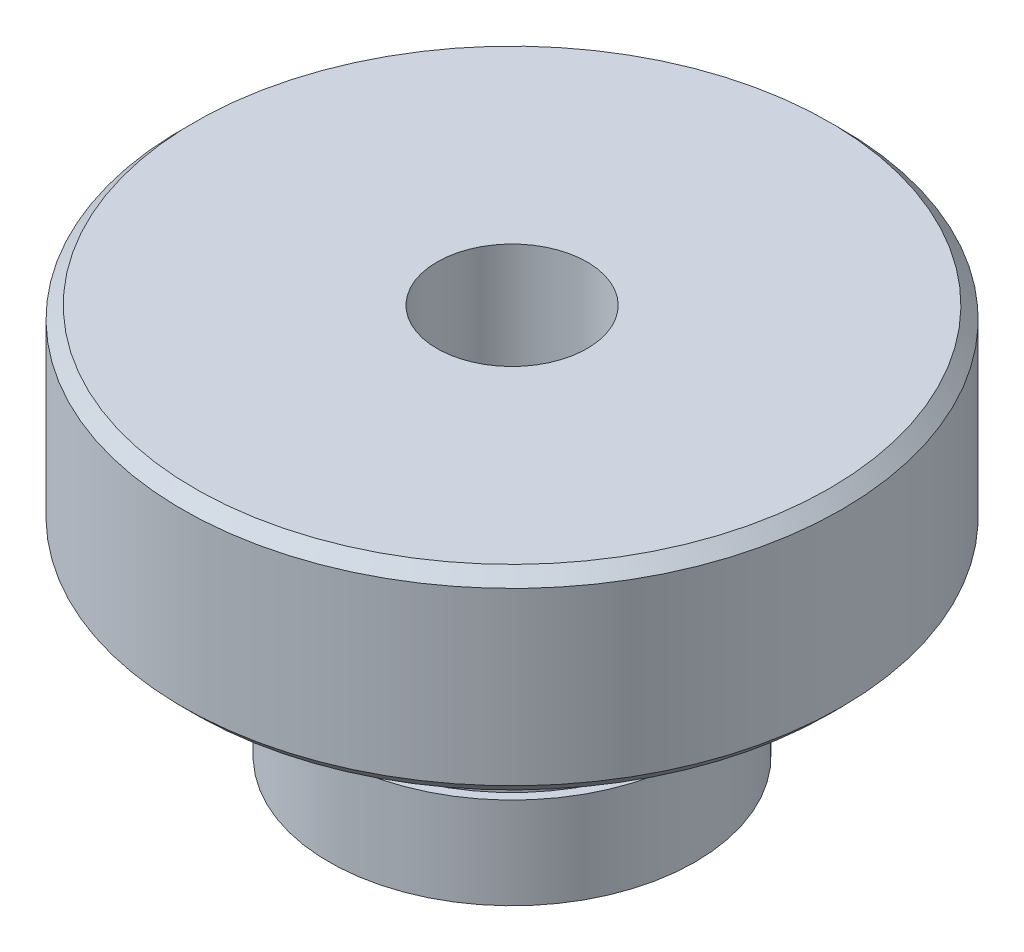
ISO-10303-21;
HEADER;
FILE_DESCRIPTION(('STEP AP214'),'2;1');
FILE_NAME('part.step','',(''),(''),'','','');
FILE_SCHEMA(('AUTOMOTIVE_DESIGN { 1 0 10303 214 1 1 1 1 }'));
ENDSEC;
DATA;
#1=APPLICATION_CONTEXT('core data for automotive mechanical design processes');
#2=APPLICATION_PROTOCOL_DEFINITION('international standard','automotive_design',2000,#1);
#3=PRODUCT_CONTEXT('',#1,'mechanical');
#4=PRODUCT('Part','Part','',(#3));
#5=PRODUCT_RELATED_PRODUCT_CATEGORY('part','',(#4));
#6=PRODUCT_DEFINITION_FORMATION('','',#4);
#7=PRODUCT_DEFINITION_CONTEXT('part definition',#1,'design');
#8=PRODUCT_DEFINITION('design','',#6,#7);
#9=PRODUCT_DEFINITION_SHAPE('','',#8);
#10=(LENGTH_UNIT() NAMED_UNIT(*) SI_UNIT(.MILLI.,.METRE.));
#11=(NAMED_UNIT(*) PLANE_ANGLE_UNIT() SI_UNIT($,.RADIAN.));
#12=(NAMED_UNIT(*) SI_UNIT($,.STERADIAN.) SOLID_ANGLE_UNIT());
#13=UNCERTAINTY_MEASURE_WITH_UNIT(LENGTH_MEASURE(1.E-05),#10,'distance_accuracy_value','');
#14=(GEOMETRIC_REPRESENTATION_CONTEXT(3) GLOBAL_UNCERTAINTY_ASSIGNED_CONTEXT((#13)) GLOBAL_UNIT_ASSIGNED_CONTEXT((#10,
#11,#12)) REPRESENTATION_CONTEXT('',''));
#15=CARTESIAN_POINT('',(0.,0.,0.));
#16=DIRECTION('',(0.,0.,1.));
#17=DIRECTION('',(1.,0.,0.));
#18=AXIS2_PLACEMENT_3D('',#15,#16,#17);
#19=CARTESIAN_POINT('',(0.,-10.1601932355876,0.));
#20=DIRECTION('',(0.,1.,0.));
#21=DIRECTION('',(-1.,0.,0.));
#22=AXIS2_PLACEMENT_3D('',#19,#20,#21);
#23=CYLINDRICAL_SURFACE('',#22,1.2295);
#24=CARTESIAN_POINT('',(0.,0.,0.));
#25=DIRECTION('',(0.,1.,0.));
#26=DIRECTION('',(-1.,0.,0.));
#27=AXIS2_PLACEMENT_3D('',#24,#25,#26);
#28=CIRCLE('',#27,1.2295);
#29=CARTESIAN_POINT('',(1.2295,0.,0.));
#30=VERTEX_POINT('',#29);
#31=EDGE_CURVE('E34',#30,#30,#28,.T.);
#32=ORIENTED_EDGE('',*,*,#31,.F.);
#33=EDGE_LOOP('',(#32));
#34=FACE_BOUND('',#33,.T.);
#35=CARTESIAN_POINT('',(0.,6.4,0.));
#36=DIRECTION('',(0.,-1.,0.));
#37=DIRECTION('',(-1.,0.,0.));
#38=AXIS2_PLACEMENT_3D('',#35,#36,#37);
#39=CIRCLE('',#38,1.2295);
#40=CARTESIAN_POINT('',(-1.2295,6.4,0.));
#41=VERTEX_POINT('',#40);
#42=EDGE_CURVE('E72',#41,#41,#39,.T.);
#43=ORIENTED_EDGE('',*,*,#42,.F.);
#44=EDGE_LOOP('',(#43));
#45=FACE_BOUND('',#44,.T.);
#46=ADVANCED_FACE('F17',(#34,#45),#23,.F.);
#47=CARTESIAN_POINT('',(0.,3.3,0.));
#48=DIRECTION('',(0.,1.,0.));
#49=DIRECTION('',(-1.,0.,0.));
#50=AXIS2_PLACEMENT_3D('',#47,#48,#49);
#51=CONICAL_SURFACE('',#50,5.3,0.785398163397446);
#52=CARTESIAN_POINT('',(0.,3.4,0.));
#53=DIRECTION('',(0.,-1.,0.));
#54=DIRECTION('',(-1.,0.,0.));
#55=AXIS2_PLACEMENT_3D('',#52,#53,#54);
#56=CIRCLE('',#55,5.4);
#57=CARTESIAN_POINT('',(5.4,3.4,0.));
#58=VERTEX_POINT('',#57);
#59=EDGE_CURVE('E11',#58,#58,#56,.T.);
#60=ORIENTED_EDGE('',*,*,#59,.T.);
#61=EDGE_LOOP('',(#60));
#62=FACE_BOUND('',#61,.T.);
#63=CARTESIAN_POINT('',(0.,3.2,0.));
#64=DIRECTION('',(0.,1.,0.));
#65=DIRECTION('',(-1.,0.,0.));
#66=AXIS2_PLACEMENT_3D('',#63,#64,#65);
#67=CIRCLE('',#66,5.2);
#68=CARTESIAN_POINT('',(5.2,3.2,0.));
#69=VERTEX_POINT('',#68);
#70=EDGE_CURVE('E27',#69,#69,#67,.T.);
#71=ORIENTED_EDGE('',*,*,#70,.T.);
#72=EDGE_LOOP('',(#71));
#73=FACE_BOUND('',#72,.T.);
#74=ADVANCED_FACE('F111',(#62,#73),#51,.T.);
#75=CARTESIAN_POINT('',(0.,4.8,0.));
#76=DIRECTION('',(0.,-1.,0.));
#77=DIRECTION('',(1.,0.,0.));
#78=AXIS2_PLACEMENT_3D('',#75,#76,#77);
#79=CYLINDRICAL_SURFACE('',#78,5.4);
#80=CARTESIAN_POINT('',(0.,6.2,0.));
#81=DIRECTION('',(0.,1.,0.));
#82=DIRECTION('',(-1.,0.,0.));
#83=AXIS2_PLACEMENT_3D('',#80,#81,#82);
#84=CIRCLE('',#83,5.4);
#85=CARTESIAN_POINT('',(5.4,6.2,0.));
#86=VERTEX_POINT('',#85);
#87=EDGE_CURVE('E74',#86,#86,#84,.T.);
#88=ORIENTED_EDGE('',*,*,#87,.F.);
#89=EDGE_LOOP('',(#88));
#90=FACE_BOUND('',#89,.T.);
#91=ORIENTED_EDGE('',*,*,#59,.F.);
#92=EDGE_LOOP('',(#91));
#93=FACE_BOUND('',#92,.T.);
#94=ADVANCED_FACE('F116',(#90,#93),#79,.T.);
#95=CARTESIAN_POINT('',(2.85,3.2,0.));
#96=DIRECTION('',(0.,-1.,0.));
#97=DIRECTION('',(0.707106781186548,0.,0.707106781186548));
#98=AXIS2_PLACEMENT_3D('',#95,#96,#97);
#99=PLANE('',#98);
#100=CARTESIAN_POINT('',(0.,3.2,0.));
#101=DIRECTION('',(0.,-1.,0.));
#102=DIRECTION('',(-1.,0.,0.));
#103=AXIS2_PLACEMENT_3D('',#100,#101,#102);
#104=CIRCLE('',#103,4.45);
#105=CARTESIAN_POINT('',(4.45,3.2,0.));
#106=VERTEX_POINT('',#105);
#107=EDGE_CURVE('E75',#106,#106,#104,.T.);
#108=ORIENTED_EDGE('',*,*,#107,.F.);
#109=EDGE_LOOP('',(#108));
#110=FACE_BOUND('',#109,.T.);
#111=ORIENTED_EDGE('',*,*,#70,.F.);
#112=EDGE_LOOP('',(#111));
#113=FACE_BOUND('',#112,.T.);
#114=ADVANCED_FACE('F123',(#110,#113),#99,.T.);
#115=CARTESIAN_POINT('',(0.,6.3,0.));
#116=DIRECTION('',(0.,-1.,0.));
#117=DIRECTION('',(-1.,0.,0.));
#118=AXIS2_PLACEMENT_3D('',#115,#116,#117);
#119=CONICAL_SURFACE('',#118,5.3,0.785398163397448);
#120=CARTESIAN_POINT('',(0.,6.4,0.));
#121=DIRECTION('',(0.,-1.,0.));
#122=DIRECTION('',(-1.,0.,0.));
#123=AXIS2_PLACEMENT_3D('',#120,#121,#122);
#124=CIRCLE('',#123,5.2);
#125=CARTESIAN_POINT('',(5.2,6.4,0.));
#126=VERTEX_POINT('',#125);
#127=EDGE_CURVE('E79',#126,#126,#124,.T.);
#128=ORIENTED_EDGE('',*,*,#127,.T.);
#129=EDGE_LOOP('',(#128));
#130=FACE_BOUND('',#129,.T.);
#131=ORIENTED_EDGE('',*,*,#87,.T.);
#132=EDGE_LOOP('',(#131));
#133=FACE_BOUND('',#132,.T.);
#134=ADVANCED_FACE('F107',(#130,#133),#119,.T.);
#135=CARTESIAN_POINT('',(5.4,6.4,0.));
#136=DIRECTION('',(0.,1.,0.));
#137=DIRECTION('',(0.707106781186548,0.,0.707106781186548));
#138=AXIS2_PLACEMENT_3D('',#135,#136,#137);
#139=PLANE('',#138);
#140=ORIENTED_EDGE('',*,*,#42,.T.);
#141=EDGE_LOOP('',(#140));
#142=FACE_BOUND('',#141,.T.);
#143=ORIENTED_EDGE('',*,*,#127,.F.);
#144=EDGE_LOOP('',(#143));
#145=FACE_BOUND('',#144,.T.);
#146=ADVANCED_FACE('F100',(#142,#145),#139,.T.);
#147=CARTESIAN_POINT('',(0.,1.6,0.));
#148=DIRECTION('',(0.,1.,0.));
#149=DIRECTION('',(0.707106781186548,0.,0.707106781186548));
#150=AXIS2_PLACEMENT_3D('',#147,#148,#149);
#151=TOROIDAL_SURFACE('',#150,4.45,1.6);
#152=ORIENTED_EDGE('',*,*,#107,.T.);
#153=EDGE_LOOP('',(#152));
#154=FACE_BOUND('',#153,.T.);
#155=CARTESIAN_POINT('',(0.,1.6,0.));
#156=DIRECTION('',(0.,1.,0.));
#157=DIRECTION('',(-1.,0.,0.));
#158=AXIS2_PLACEMENT_3D('',#155,#156,#157);
#159=CIRCLE('',#158,2.85);
#160=CARTESIAN_POINT('',(2.85,1.6,0.));
#161=VERTEX_POINT('',#160);
#162=EDGE_CURVE('E84',#161,#161,#159,.T.);
#163=ORIENTED_EDGE('',*,*,#162,.T.);
#164=EDGE_LOOP('',(#163));
#165=FACE_BOUND('',#164,.T.);
#166=ADVANCED_FACE('F96',(#154,#165),#151,.F.);
#167=CARTESIAN_POINT('',(0.,2.35,0.));
#168=DIRECTION('',(0.,-1.,0.));
#169=DIRECTION('',(1.,0.,0.));
#170=AXIS2_PLACEMENT_3D('',#167,#168,#169);
#171=CYLINDRICAL_SURFACE('',#170,2.85);
#172=CARTESIAN_POINT('',(0.,1.5,0.));
#173=DIRECTION('',(0.,-1.,0.));
#174=DIRECTION('',(1.,0.,0.));
#175=AXIS2_PLACEMENT_3D('',#172,#173,#174);
#176=CIRCLE('',#175,2.85);
#177=CARTESIAN_POINT('',(2.85,1.5,0.));
#178=VERTEX_POINT('',#177);
#179=EDGE_CURVE('E70',#178,#178,#176,.T.);
#180=ORIENTED_EDGE('',*,*,#179,.F.);
#181=EDGE_LOOP('',(#180));
#182=FACE_BOUND('',#181,.T.);
#183=ORIENTED_EDGE('',*,*,#162,.F.);
#184=EDGE_LOOP('',(#183));
#185=FACE_BOUND('',#184,.T.);
#186=ADVANCED_FACE('F93',(#182,#185),#171,.T.);
#187=CARTESIAN_POINT('',(3.,1.5,0.));
#188=DIRECTION('',(0.,1.,0.));
#189=DIRECTION('',(0.707106781186548,0.,0.707106781186548));
#190=AXIS2_PLACEMENT_3D('',#187,#188,#189);
#191=PLANE('',#190);
#192=ORIENTED_EDGE('',*,*,#179,.T.);
#193=EDGE_LOOP('',(#192));
#194=FACE_BOUND('',#193,.T.);
#195=CARTESIAN_POINT('',(0.,1.5,0.));
#196=DIRECTION('',(0.,-1.,0.));
#197=DIRECTION('',(1.,0.,0.));
#198=AXIS2_PLACEMENT_3D('',#195,#196,#197);
#199=CIRCLE('',#198,3.);
#200=CARTESIAN_POINT('',(3.,1.5,0.));
#201=VERTEX_POINT('',#200);
#202=EDGE_CURVE('E62',#201,#201,#199,.T.);
#203=ORIENTED_EDGE('',*,*,#202,.F.);
#204=EDGE_LOOP('',(#203));
#205=FACE_BOUND('',#204,.T.);
#206=ADVANCED_FACE('F91',(#194,#205),#191,.T.);
#207=CARTESIAN_POINT('',(0.,0.75,0.));
#208=DIRECTION('',(0.,-1.,0.));
#209=DIRECTION('',(1.,0.,0.));
#210=AXIS2_PLACEMENT_3D('',#207,#208,#209);
#211=CYLINDRICAL_SURFACE('',#210,3.);
#212=ORIENTED_EDGE('',*,*,#202,.T.);
#213=EDGE_LOOP('',(#212));
#214=FACE_BOUND('',#213,.T.);
#215=CARTESIAN_POINT('',(0.,0.,0.));
#216=DIRECTION('',(0.,-1.,0.));
#217=DIRECTION('',(1.,0.,0.));
#218=AXIS2_PLACEMENT_3D('',#215,#216,#217);
#219=CIRCLE('',#218,3.);
#220=CARTESIAN_POINT('',(3.,0.,0.));
#221=VERTEX_POINT('',#220);
#222=EDGE_CURVE('E21',#221,#221,#219,.T.);
#223=ORIENTED_EDGE('',*,*,#222,.F.);
#224=EDGE_LOOP('',(#223));
#225=FACE_BOUND('',#224,.T.);
#226=ADVANCED_FACE('F66',(#214,#225),#211,.T.);
#227=CARTESIAN_POINT('',(0.,0.,0.));
#228=DIRECTION('',(0.,-1.,0.));
#229=DIRECTION('',(0.707106781186548,0.,0.707106781186548));
#230=AXIS2_PLACEMENT_3D('',#227,#228,#229);
#231=PLANE('',#230);
#232=ORIENTED_EDGE('',*,*,#31,.T.);
#233=EDGE_LOOP('',(#232));
#234=FACE_BOUND('',#233,.T.);
#235=ORIENTED_EDGE('',*,*,#222,.T.);
#236=EDGE_LOOP('',(#235));
#237=FACE_BOUND('',#236,.T.);
#238=ADVANCED_FACE('F19',(#234,#237),#231,.T.);
#239=CLOSED_SHELL('',(#46,#74,#94,#114,#134,#146,#166,#186,#206,#226,#238));
#240=MANIFOLD_SOLID_BREP('B1',#239);
#241=ADVANCED_BREP_SHAPE_REPRESENTATION('',(#18,#240),#14);
#242=SHAPE_DEFINITION_REPRESENTATION(#9,#241);
ENDSEC;
END-ISO-10303-21;
